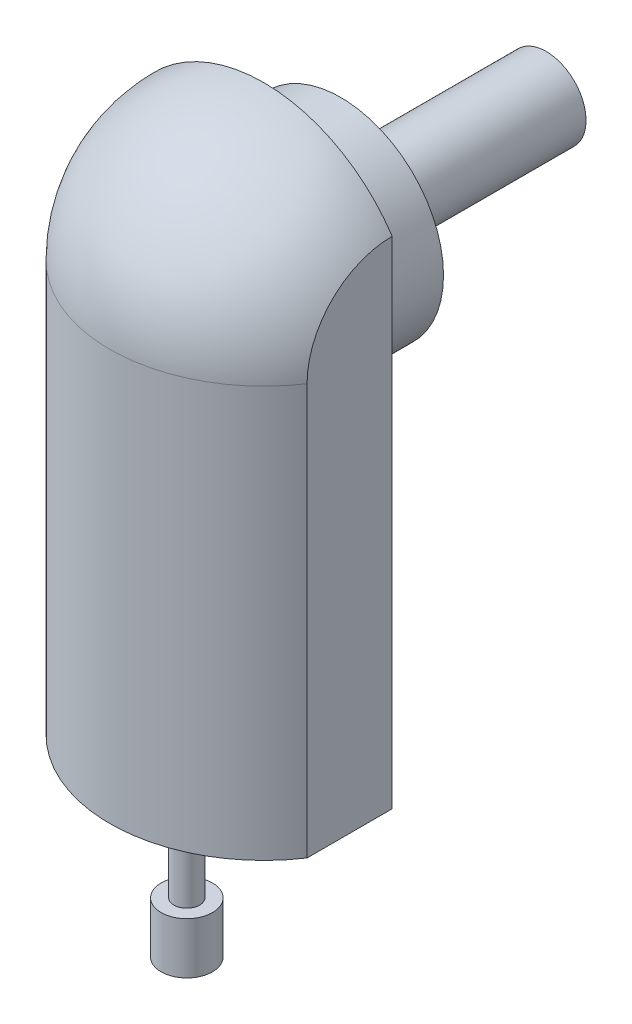
ISO-10303-21;
HEADER;
FILE_DESCRIPTION(('STEP AP214'),'2;1');
FILE_NAME('part.step','',(''),(''),'','','');
FILE_SCHEMA(('AUTOMOTIVE_DESIGN { 1 0 10303 214 1 1 1 1 }'));
ENDSEC;
DATA;
#1=APPLICATION_CONTEXT('core data for automotive mechanical design processes');
#2=APPLICATION_PROTOCOL_DEFINITION('international standard','automotive_design',2000,#1);
#3=PRODUCT_CONTEXT('',#1,'mechanical');
#4=PRODUCT('Part','Part','',(#3));
#5=PRODUCT_RELATED_PRODUCT_CATEGORY('part','',(#4));
#6=PRODUCT_DEFINITION_FORMATION('','',#4);
#7=PRODUCT_DEFINITION_CONTEXT('part definition',#1,'design');
#8=PRODUCT_DEFINITION('design','',#6,#7);
#9=PRODUCT_DEFINITION_SHAPE('','',#8);
#10=(LENGTH_UNIT() NAMED_UNIT(*) SI_UNIT(.MILLI.,.METRE.));
#11=(NAMED_UNIT(*) PLANE_ANGLE_UNIT() SI_UNIT($,.RADIAN.));
#12=(NAMED_UNIT(*) SI_UNIT($,.STERADIAN.) SOLID_ANGLE_UNIT());
#13=UNCERTAINTY_MEASURE_WITH_UNIT(LENGTH_MEASURE(1.E-05),#10,'distance_accuracy_value','');
#14=(GEOMETRIC_REPRESENTATION_CONTEXT(3) GLOBAL_UNCERTAINTY_ASSIGNED_CONTEXT((#13)) GLOBAL_UNIT_ASSIGNED_CONTEXT((#10,
#11,#12)) REPRESENTATION_CONTEXT('',''));
#15=CARTESIAN_POINT('',(0.,0.,0.));
#16=DIRECTION('',(0.,0.,1.));
#17=DIRECTION('',(1.,0.,0.));
#18=AXIS2_PLACEMENT_3D('',#15,#16,#17);
#19=CARTESIAN_POINT('',(0.,0.,38.1));
#20=DIRECTION('',(0.,1.,0.));
#21=DIRECTION('',(-1.,0.,0.));
#22=AXIS2_PLACEMENT_3D('',#19,#20,#21);
#23=SPHERICAL_SURFACE('',#22,76.2);
#24=CARTESIAN_POINT('',(-63.5,0.,38.1));
#25=DIRECTION('',(-1.,0.,0.));
#26=DIRECTION('',(0.,0.,1.));
#27=AXIS2_PLACEMENT_3D('',#24,#25,#26);
#28=CIRCLE('',#27,42.1211348375135);
#29=CARTESIAN_POINT('',(-63.5,0.,80.2211348375136));
#30=VERTEX_POINT('',#29);
#31=CARTESIAN_POINT('',(-63.5,42.1211348375135,38.1));
#32=VERTEX_POINT('',#31);
#33=EDGE_CURVE('E320',#30,#32,#28,.T.);
#34=ORIENTED_EDGE('',*,*,#33,.F.);
#35=CARTESIAN_POINT('',(0.,0.,38.1));
#36=DIRECTION('',(0.,1.,0.));
#37=DIRECTION('',(0.,0.,-1.));
#38=AXIS2_PLACEMENT_3D('',#35,#36,#37);
#39=CIRCLE('',#38,76.2);
#40=CARTESIAN_POINT('',(63.5,0.,80.2211348375136));
#41=VERTEX_POINT('',#40);
#42=EDGE_CURVE('E335',#30,#41,#39,.T.);
#43=ORIENTED_EDGE('',*,*,#42,.T.);
#44=CARTESIAN_POINT('',(63.5,0.,38.1));
#45=DIRECTION('',(1.,0.,0.));
#46=DIRECTION('',(0.,0.,-1.));
#47=AXIS2_PLACEMENT_3D('',#44,#45,#46);
#48=CIRCLE('',#47,42.1211348375136);
#49=CARTESIAN_POINT('',(63.5,42.1211348375136,38.1));
#50=VERTEX_POINT('',#49);
#51=EDGE_CURVE('E331',#50,#41,#48,.T.);
#52=ORIENTED_EDGE('',*,*,#51,.F.);
#53=CARTESIAN_POINT('',(0.,0.,38.1));
#54=DIRECTION('',(0.,0.,-1.));
#55=DIRECTION('',(-1.,0.,0.));
#56=AXIS2_PLACEMENT_3D('',#53,#54,#55);
#57=CIRCLE('',#56,76.2);
#58=EDGE_CURVE('E343',#32,#50,#57,.T.);
#59=ORIENTED_EDGE('',*,*,#58,.F.);
#60=EDGE_LOOP('',(#34,#43,#52,#59));
#61=FACE_BOUND('',#60,.T.);
#62=ADVANCED_FACE('F41',(#61),#23,.T.);
#63=CARTESIAN_POINT('',(0.,0.,38.1));
#64=DIRECTION('',(0.,0.,-1.));
#65=DIRECTION('',(-1.,0.,0.));
#66=AXIS2_PLACEMENT_3D('',#63,#64,#65);
#67=PLANE('',#66);
#68=CARTESIAN_POINT('',(0.,0.,38.1));
#69=DIRECTION('',(0.,0.,1.));
#70=DIRECTION('',(1.,0.,0.));
#71=AXIS2_PLACEMENT_3D('',#68,#69,#70);
#72=CIRCLE('',#71,50.8);
#73=CARTESIAN_POINT('',(-50.8,0.,38.1));
#74=VERTEX_POINT('',#73);
#75=EDGE_CURVE('E349',#74,#74,#72,.T.);
#76=ORIENTED_EDGE('',*,*,#75,.T.);
#77=EDGE_LOOP('',(#76));
#78=FACE_BOUND('',#77,.T.);
#79=DIRECTION('',(-1.,0.,0.));
#80=VECTOR('',#79,1.);
#81=CARTESIAN_POINT('',(-76.2,-203.2,38.0999999999994));
#82=LINE('',#81,#80);
#83=CARTESIAN_POINT('',(63.5,-203.2,38.1));
#84=VERTEX_POINT('',#83);
#85=CARTESIAN_POINT('',(-63.5,-203.2,38.0999999999995));
#86=VERTEX_POINT('',#85);
#87=EDGE_CURVE('E339',#84,#86,#82,.T.);
#88=ORIENTED_EDGE('',*,*,#87,.T.);
#89=DIRECTION('',(0.,1.,0.));
#90=VECTOR('',#89,1.);
#91=CARTESIAN_POINT('',(-63.5,-203.2,38.1));
#92=LINE('',#91,#90);
#93=EDGE_CURVE('E311',#86,#32,#92,.T.);
#94=ORIENTED_EDGE('',*,*,#93,.T.);
#95=ORIENTED_EDGE('',*,*,#58,.T.);
#96=DIRECTION('',(0.,1.,0.));
#97=VECTOR('',#96,1.);
#98=CARTESIAN_POINT('',(63.5,-203.2,38.1));
#99=LINE('',#98,#97);
#100=EDGE_CURVE('E323',#84,#50,#99,.T.);
#101=ORIENTED_EDGE('',*,*,#100,.F.);
#102=EDGE_LOOP('',(#88,#94,#95,#101));
#103=FACE_BOUND('',#102,.T.);
#104=ADVANCED_FACE('F367',(#78,#103),#67,.T.);
#105=CARTESIAN_POINT('',(0.,-203.2,38.1));
#106=DIRECTION('',(0.,1.,0.));
#107=DIRECTION('',(0.,0.,1.));
#108=AXIS2_PLACEMENT_3D('',#105,#106,#107);
#109=CYLINDRICAL_SURFACE('',#108,76.2);
#110=ORIENTED_EDGE('',*,*,#42,.F.);
#111=DIRECTION('',(0.,1.,0.));
#112=VECTOR('',#111,1.);
#113=CARTESIAN_POINT('',(-63.5,-203.2,80.2211348375136));
#114=LINE('',#113,#112);
#115=CARTESIAN_POINT('',(-63.5,-203.2,80.2211348375136));
#116=VERTEX_POINT('',#115);
#117=EDGE_CURVE('E316',#30,#116,#114,.F.);
#118=ORIENTED_EDGE('',*,*,#117,.T.);
#119=CARTESIAN_POINT('',(0.,-203.2,38.1));
#120=DIRECTION('',(0.,1.,0.));
#121=DIRECTION('',(0.,0.,-1.));
#122=AXIS2_PLACEMENT_3D('',#119,#120,#121);
#123=CIRCLE('',#122,76.2);
#124=CARTESIAN_POINT('',(63.5,-203.2,80.2211348375136));
#125=VERTEX_POINT('',#124);
#126=EDGE_CURVE('E336',#116,#125,#123,.T.);
#127=ORIENTED_EDGE('',*,*,#126,.T.);
#128=DIRECTION('',(0.,1.,0.));
#129=VECTOR('',#128,1.);
#130=CARTESIAN_POINT('',(63.5,-203.2,80.2211348375136));
#131=LINE('',#130,#129);
#132=EDGE_CURVE('E327',#125,#41,#131,.T.);
#133=ORIENTED_EDGE('',*,*,#132,.T.);
#134=EDGE_LOOP('',(#110,#118,#127,#133));
#135=FACE_BOUND('',#134,.T.);
#136=ADVANCED_FACE('F377',(#135),#109,.T.);
#137=CARTESIAN_POINT('',(0.,-203.2,38.1));
#138=DIRECTION('',(0.,-1.,0.));
#139=DIRECTION('',(0.,0.,-1.));
#140=AXIS2_PLACEMENT_3D('',#137,#138,#139);
#141=PLANE('',#140);
#142=CARTESIAN_POINT('',(0.,-203.2,76.2));
#143=DIRECTION('',(0.,-1.,0.));
#144=DIRECTION('',(0.,0.,-1.));
#145=AXIS2_PLACEMENT_3D('',#142,#143,#144);
#146=CIRCLE('',#145,6.35);
#147=CARTESIAN_POINT('',(0.,-203.2,69.85));
#148=VERTEX_POINT('',#147);
#149=EDGE_CURVE('E297',#148,#148,#146,.T.);
#150=ORIENTED_EDGE('',*,*,#149,.F.);
#151=EDGE_LOOP('',(#150));
#152=FACE_BOUND('',#151,.T.);
#153=ORIENTED_EDGE('',*,*,#126,.F.);
#154=DIRECTION('',(0.,0.,-1.));
#155=VECTOR('',#154,1.);
#156=CARTESIAN_POINT('',(-63.5,-203.2,38.1));
#157=LINE('',#156,#155);
#158=EDGE_CURVE('E45',#116,#86,#157,.T.);
#159=ORIENTED_EDGE('',*,*,#158,.T.);
#160=ORIENTED_EDGE('',*,*,#87,.F.);
#161=DIRECTION('',(0.,0.,1.));
#162=VECTOR('',#161,1.);
#163=CARTESIAN_POINT('',(63.5,-203.2,38.1));
#164=LINE('',#163,#162);
#165=EDGE_CURVE('E353',#84,#125,#164,.T.);
#166=ORIENTED_EDGE('',*,*,#165,.T.);
#167=EDGE_LOOP('',(#153,#159,#160,#166));
#168=FACE_BOUND('',#167,.T.);
#169=ADVANCED_FACE('F363',(#152,#168),#141,.T.);
#170=CARTESIAN_POINT('',(0.,0.,38.1));
#171=DIRECTION('',(0.,0.,-1.));
#172=DIRECTION('',(-1.,0.,0.));
#173=AXIS2_PLACEMENT_3D('',#170,#171,#172);
#174=CYLINDRICAL_SURFACE('',#173,50.8);
#175=CARTESIAN_POINT('',(0.,0.,0.));
#176=DIRECTION('',(0.,0.,1.));
#177=DIRECTION('',(1.,0.,0.));
#178=AXIS2_PLACEMENT_3D('',#175,#176,#177);
#179=CIRCLE('',#178,50.8);
#180=CARTESIAN_POINT('',(-50.8,0.,0.));
#181=VERTEX_POINT('',#180);
#182=EDGE_CURVE('E348',#181,#181,#179,.T.);
#183=CARTESIAN_POINT('',(-50.8,0.,38.1));
#184=CARTESIAN_POINT('',(-50.8,0.,37.703125));
#185=CARTESIAN_POINT('',(-50.8,0.,37.30625));
#186=CARTESIAN_POINT('',(-50.8,0.,36.5125));
#187=CARTESIAN_POINT('',(-50.8,0.,36.115625));
#188=CARTESIAN_POINT('',(-50.8,0.,35.321875));
#189=CARTESIAN_POINT('',(-50.8,0.,34.925));
#190=CARTESIAN_POINT('',(-50.8,0.,34.13125));
#191=CARTESIAN_POINT('',(-50.8,0.,33.734375));
#192=CARTESIAN_POINT('',(-50.8,0.,32.940625));
#193=CARTESIAN_POINT('',(-50.8,0.,32.54375));
#194=CARTESIAN_POINT('',(-50.8,0.,31.75));
#195=CARTESIAN_POINT('',(-50.8,0.,31.353125));
#196=CARTESIAN_POINT('',(-50.8,0.,30.559375));
#197=CARTESIAN_POINT('',(-50.8,0.,30.1625));
#198=CARTESIAN_POINT('',(-50.8,0.,29.36875));
#199=CARTESIAN_POINT('',(-50.8,0.,28.971875));
#200=CARTESIAN_POINT('',(-50.8,0.,28.178125));
#201=CARTESIAN_POINT('',(-50.8,0.,27.78125));
#202=CARTESIAN_POINT('',(-50.8,0.,26.9875));
#203=CARTESIAN_POINT('',(-50.8,0.,26.590625));
#204=CARTESIAN_POINT('',(-50.8,0.,25.796875));
#205=CARTESIAN_POINT('',(-50.8,0.,25.4));
#206=CARTESIAN_POINT('',(-50.8,0.,24.60625));
#207=CARTESIAN_POINT('',(-50.8,0.,24.209375));
#208=CARTESIAN_POINT('',(-50.8,0.,23.415625));
#209=CARTESIAN_POINT('',(-50.8,0.,23.01875));
#210=CARTESIAN_POINT('',(-50.8,0.,22.225));
#211=CARTESIAN_POINT('',(-50.8,0.,21.828125));
#212=CARTESIAN_POINT('',(-50.8,0.,21.034375));
#213=CARTESIAN_POINT('',(-50.8,0.,20.6375));
#214=CARTESIAN_POINT('',(-50.8,0.,19.84375));
#215=CARTESIAN_POINT('',(-50.8,0.,19.446875));
#216=CARTESIAN_POINT('',(-50.8,0.,18.653125));
#217=CARTESIAN_POINT('',(-50.8,0.,18.25625));
#218=CARTESIAN_POINT('',(-50.8,0.,17.4625));
#219=CARTESIAN_POINT('',(-50.8,0.,17.065625));
#220=CARTESIAN_POINT('',(-50.8,0.,16.271875));
#221=CARTESIAN_POINT('',(-50.8,0.,15.875));
#222=CARTESIAN_POINT('',(-50.8,0.,15.08125));
#223=CARTESIAN_POINT('',(-50.8,0.,14.684375));
#224=CARTESIAN_POINT('',(-50.8,0.,13.890625));
#225=CARTESIAN_POINT('',(-50.8,0.,13.49375));
#226=CARTESIAN_POINT('',(-50.8,0.,12.7));
#227=CARTESIAN_POINT('',(-50.8,0.,12.303125));
#228=CARTESIAN_POINT('',(-50.8,0.,11.509375));
#229=CARTESIAN_POINT('',(-50.8,0.,11.1125));
#230=CARTESIAN_POINT('',(-50.8,0.,10.31875));
#231=CARTESIAN_POINT('',(-50.8,0.,9.92187499999999));
#232=CARTESIAN_POINT('',(-50.8,0.,9.128125));
#233=CARTESIAN_POINT('',(-50.8,0.,8.73124999999999));
#234=CARTESIAN_POINT('',(-50.8,0.,7.93749999999999));
#235=CARTESIAN_POINT('',(-50.8,0.,7.54062499999999));
#236=CARTESIAN_POINT('',(-50.8,0.,6.746875));
#237=CARTESIAN_POINT('',(-50.8,0.,6.35));
#238=CARTESIAN_POINT('',(-50.8,0.,5.55625));
#239=CARTESIAN_POINT('',(-50.8,0.,5.159375));
#240=CARTESIAN_POINT('',(-50.8,0.,4.365625));
#241=CARTESIAN_POINT('',(-50.8,0.,3.96875));
#242=CARTESIAN_POINT('',(-50.8,0.,3.175));
#243=CARTESIAN_POINT('',(-50.8,0.,2.778125));
#244=CARTESIAN_POINT('',(-50.8,0.,1.984375));
#245=CARTESIAN_POINT('',(-50.8,0.,1.5875));
#246=CARTESIAN_POINT('',(-50.8,0.,0.79375));
#247=CARTESIAN_POINT('',(-50.8,0.,0.396875));
#248=CARTESIAN_POINT('',(-50.8,0.,0.));
#249=B_SPLINE_CURVE_WITH_KNOTS('',3,(#183,#184,#185,#186,#187,#188,#189,#190,#191,#192,#193,
#194,#195,#196,#197,#198,#199,#200,#201,#202,#203,#204,#205,#206,#207,#208,#209,#210,#211,#212,
#213,#214,#215,#216,#217,#218,#219,#220,#221,#222,#223,#224,#225,#226,#227,#228,#229,#230,#231,
#232,#233,#234,#235,#236,#237,#238,#239,#240,#241,#242,#243,#244,#245,#246,#247,#248),
.UNSPECIFIED.,.F.,.F.,(4,2,2,2,2,2,2,2,2,2,2,2,2,2,2,2,2,2,2,2,2,2,2,2,2,2,2,2,2,2,2,2,4),(0.,
1.190625,2.38125,3.571875,4.7625,5.953125,7.14375,8.334375,9.52500000000001,10.715625,11.90625,
13.096875,14.2875,15.478125,16.66875,17.859375,19.05,20.240625,21.43125,22.621875,23.8125,
25.003125,26.19375,27.384375,28.575,29.765625,30.95625,32.146875,33.3375,34.528125,35.71875,
36.909375,38.1),.UNSPECIFIED.);
#250=EDGE_CURVE('BSEAM43',#74,#181,#249,.T.);
#251=ORIENTED_EDGE('',*,*,#75,.F.);
#252=ORIENTED_EDGE('',*,*,#182,.T.);
#253=ORIENTED_EDGE('',*,*,#250,.T.);
#254=ORIENTED_EDGE('',*,*,#250,.F.);
#255=EDGE_LOOP('',(#251,#253,#252,#254));
#256=FACE_BOUND('',#255,.T.);
#257=ADVANCED_FACE('F43',(#256),#174,.T.);
#258=CARTESIAN_POINT('',(0.,0.,0.));
#259=DIRECTION('',(0.,0.,1.));
#260=DIRECTION('',(1.,0.,0.));
#261=AXIS2_PLACEMENT_3D('',#258,#259,#260);
#262=PLANE('',#261);
#263=CARTESIAN_POINT('',(0.,0.,0.));
#264=DIRECTION('',(0.,0.,-1.));
#265=DIRECTION('',(-1.,0.,0.));
#266=AXIS2_PLACEMENT_3D('',#263,#264,#265);
#267=CIRCLE('',#266,19.7047921076596);
#268=CARTESIAN_POINT('',(-19.7047921076596,0.,0.));
#269=VERTEX_POINT('',#268);
#270=EDGE_CURVE('E11',#269,#269,#267,.T.);
#271=ORIENTED_EDGE('',*,*,#270,.F.);
#272=EDGE_LOOP('',(#271));
#273=FACE_BOUND('',#272,.T.);
#274=ORIENTED_EDGE('',*,*,#182,.F.);
#275=EDGE_LOOP('',(#274));
#276=FACE_BOUND('',#275,.T.);
#277=ADVANCED_FACE('F389',(#273,#276),#262,.F.);
#278=CARTESIAN_POINT('',(63.5,0.,0.));
#279=DIRECTION('',(1.,0.,0.));
#280=DIRECTION('',(0.,0.,-1.));
#281=AXIS2_PLACEMENT_3D('',#278,#279,#280);
#282=PLANE('',#281);
#283=ORIENTED_EDGE('',*,*,#51,.T.);
#284=ORIENTED_EDGE('',*,*,#132,.F.);
#285=ORIENTED_EDGE('',*,*,#165,.F.);
#286=ORIENTED_EDGE('',*,*,#100,.T.);
#287=EDGE_LOOP('',(#283,#284,#285,#286));
#288=FACE_BOUND('',#287,.T.);
#289=ADVANCED_FACE('F371',(#288),#282,.T.);
#290=CARTESIAN_POINT('',(-63.5,0.,0.));
#291=DIRECTION('',(-1.,0.,0.));
#292=DIRECTION('',(0.,0.,-1.));
#293=AXIS2_PLACEMENT_3D('',#290,#291,#292);
#294=PLANE('',#293);
#295=ORIENTED_EDGE('',*,*,#33,.T.);
#296=ORIENTED_EDGE('',*,*,#93,.F.);
#297=ORIENTED_EDGE('',*,*,#158,.F.);
#298=ORIENTED_EDGE('',*,*,#117,.F.);
#299=EDGE_LOOP('',(#295,#296,#297,#298));
#300=FACE_BOUND('',#299,.T.);
#301=ADVANCED_FACE('F378',(#300),#294,.T.);
#302=CARTESIAN_POINT('',(0.,0.,-101.6));
#303=DIRECTION('',(0.,0.,1.));
#304=DIRECTION('',(1.,0.,0.));
#305=AXIS2_PLACEMENT_3D('',#302,#303,#304);
#306=CYLINDRICAL_SURFACE('',#305,19.7047921076596);
#307=CARTESIAN_POINT('',(0.,0.,-101.6));
#308=DIRECTION('',(0.,0.,-1.));
#309=DIRECTION('',(-1.,0.,0.));
#310=AXIS2_PLACEMENT_3D('',#307,#308,#309);
#311=CIRCLE('',#310,19.7047921076596);
#312=CARTESIAN_POINT('',(-19.7047921076596,0.,-101.6));
#313=VERTEX_POINT('',#312);
#314=EDGE_CURVE('E305',#313,#313,#311,.T.);
#315=ORIENTED_EDGE('',*,*,#314,.F.);
#316=EDGE_LOOP('',(#315));
#317=FACE_BOUND('',#316,.T.);
#318=ORIENTED_EDGE('',*,*,#270,.T.);
#319=EDGE_LOOP('',(#318));
#320=FACE_BOUND('',#319,.T.);
#321=ADVANCED_FACE('F380',(#317,#320),#306,.T.);
#322=CARTESIAN_POINT('',(0.,0.,-101.6));
#323=DIRECTION('',(0.,0.,-1.));
#324=DIRECTION('',(-1.,0.,0.));
#325=AXIS2_PLACEMENT_3D('',#322,#323,#324);
#326=PLANE('',#325);
#327=ORIENTED_EDGE('',*,*,#314,.T.);
#328=EDGE_LOOP('',(#327));
#329=FACE_BOUND('',#328,.T.);
#330=ADVANCED_FACE('F386',(#329),#326,.T.);
#331=CARTESIAN_POINT('',(0.,-254.,76.2));
#332=DIRECTION('',(0.,1.,0.));
#333=DIRECTION('',(0.,0.,1.));
#334=AXIS2_PLACEMENT_3D('',#331,#332,#333);
#335=CYLINDRICAL_SURFACE('',#334,6.35);
#336=CARTESIAN_POINT('',(0.,-254.,76.2));
#337=DIRECTION('',(0.,-1.,0.));
#338=DIRECTION('',(0.,0.,-1.));
#339=AXIS2_PLACEMENT_3D('',#336,#337,#338);
#340=CIRCLE('',#339,6.35);
#341=CARTESIAN_POINT('',(0.,-254.,69.85));
#342=VERTEX_POINT('',#341);
#343=EDGE_CURVE('E301',#342,#342,#340,.T.);
#344=ORIENTED_EDGE('',*,*,#343,.F.);
#345=EDGE_LOOP('',(#344));
#346=FACE_BOUND('',#345,.T.);
#347=ORIENTED_EDGE('',*,*,#149,.T.);
#348=EDGE_LOOP('',(#347));
#349=FACE_BOUND('',#348,.T.);
#350=ADVANCED_FACE('F421',(#346,#349),#335,.T.);
#351=CARTESIAN_POINT('',(0.,-279.4,76.2));
#352=DIRECTION('',(0.,1.,0.));
#353=DIRECTION('',(0.,0.,1.));
#354=AXIS2_PLACEMENT_3D('',#351,#352,#353);
#355=CYLINDRICAL_SURFACE('',#354,12.7);
#356=CARTESIAN_POINT('',(0.,-279.4,76.2));
#357=DIRECTION('',(0.,-1.,0.));
#358=DIRECTION('',(0.,0.,-1.));
#359=AXIS2_PLACEMENT_3D('',#356,#357,#358);
#360=CIRCLE('',#359,12.7);
#361=CARTESIAN_POINT('',(0.,-279.4,63.5));
#362=VERTEX_POINT('',#361);
#363=EDGE_CURVE('E293',#362,#362,#360,.T.);
#364=ORIENTED_EDGE('',*,*,#363,.F.);
#365=EDGE_LOOP('',(#364));
#366=FACE_BOUND('',#365,.T.);
#367=CARTESIAN_POINT('',(0.,-254.,76.2));
#368=DIRECTION('',(0.,-1.,0.));
#369=DIRECTION('',(0.,0.,-1.));
#370=AXIS2_PLACEMENT_3D('',#367,#368,#369);
#371=CIRCLE('',#370,12.7);
#372=CARTESIAN_POINT('',(0.,-254.,63.5));
#373=VERTEX_POINT('',#372);
#374=EDGE_CURVE('E283',#373,#373,#371,.T.);
#375=ORIENTED_EDGE('',*,*,#374,.T.);
#376=EDGE_LOOP('',(#375));
#377=FACE_BOUND('',#376,.T.);
#378=ADVANCED_FACE('F423',(#366,#377),#355,.T.);
#379=CARTESIAN_POINT('',(0.,-279.4,76.2));
#380=DIRECTION('',(0.,-1.,0.));
#381=DIRECTION('',(0.,0.,-1.));
#382=AXIS2_PLACEMENT_3D('',#379,#380,#381);
#383=PLANE('',#382);
#384=CARTESIAN_POINT('',(0.,-279.4,76.2));
#385=DIRECTION('',(0.,1.,0.));
#386=DIRECTION('',(0.,0.,-1.));
#387=AXIS2_PLACEMENT_3D('',#384,#385,#386);
#388=CIRCLE('',#387,7.43174427837488);
#389=CARTESIAN_POINT('',(0.,-279.4,68.7682557216251));
#390=VERTEX_POINT('',#389);
#391=CARTESIAN_POINT('',(-6.77807617925276,-279.4,73.1522949080654));
#392=VERTEX_POINT('',#391);
#393=EDGE_CURVE('E58',#390,#392,#388,.T.);
#394=ORIENTED_EDGE('',*,*,#393,.F.);
#395=DIRECTION('',(0.,0.,1.));
#396=VECTOR('',#395,1.);
#397=CARTESIAN_POINT('',(0.,-279.4,68.7682557216251));
#398=LINE('',#397,#396);
#399=CARTESIAN_POINT('',(0.,-279.4,66.5464125625799));
#400=VERTEX_POINT('',#399);
#401=EDGE_CURVE('E213',#400,#390,#398,.T.);
#402=ORIENTED_EDGE('',*,*,#401,.F.);
#403=CARTESIAN_POINT('',(0.,-279.4,76.2));
#404=DIRECTION('',(0.,-1.,0.));
#405=DIRECTION('',(0.,0.,-1.));
#406=AXIS2_PLACEMENT_3D('',#403,#404,#405);
#407=CIRCLE('',#406,9.65358743742012);
#408=CARTESIAN_POINT('',(-8.80449442324183,-279.4,72.2411329445131));
#409=VERTEX_POINT('',#408);
#410=EDGE_CURVE('E232',#409,#400,#407,.T.);
#411=ORIENTED_EDGE('',*,*,#410,.F.);
#412=DIRECTION('',(-0.912043784791656,0.,-0.410092836590585));
#413=VECTOR('',#412,1.);
#414=CARTESIAN_POINT('',(-6.77807617925276,-279.4,73.1522949080654));
#415=LINE('',#414,#413);
#416=EDGE_CURVE('E228',#392,#409,#415,.T.);
#417=ORIENTED_EDGE('',*,*,#416,.F.);
#418=EDGE_LOOP('',(#394,#402,#411,#417));
#419=FACE_BOUND('',#418,.T.);
#420=CARTESIAN_POINT('',(0.,-279.4,76.2));
#421=DIRECTION('',(0.,1.,0.));
#422=DIRECTION('',(0.,0.,-1.));
#423=AXIS2_PLACEMENT_3D('',#420,#421,#422);
#424=CIRCLE('',#423,7.43174427837489);
#425=CARTESIAN_POINT('',(6.06793670222131,-279.4,80.4908002979623));
#426=VERTEX_POINT('',#425);
#427=CARTESIAN_POINT('',(6.77807617925276,-279.4,73.1522949080654));
#428=VERTEX_POINT('',#427);
#429=EDGE_CURVE('E66',#426,#428,#424,.T.);
#430=ORIENTED_EDGE('',*,*,#429,.F.);
#431=DIRECTION('',(-0.816488898827961,0.,-0.577361133165979));
#432=VECTOR('',#431,1.);
#433=CARTESIAN_POINT('',(6.06793670222131,-279.4,80.4908002979623));
#434=LINE('',#433,#432);
#435=CARTESIAN_POINT('',(7.8820469765186,-279.4,81.7736061819857));
#436=VERTEX_POINT('',#435);
#437=EDGE_CURVE('E179',#436,#426,#434,.T.);
#438=ORIENTED_EDGE('',*,*,#437,.F.);
#439=CARTESIAN_POINT('',(0.,-279.4,76.2));
#440=DIRECTION('',(0.,-1.,0.));
#441=DIRECTION('',(0.,0.,-1.));
#442=AXIS2_PLACEMENT_3D('',#439,#440,#441);
#443=CIRCLE('',#442,9.65358743742012);
#444=CARTESIAN_POINT('',(8.80449442324183,-279.4,72.2411329445131));
#445=VERTEX_POINT('',#444);
#446=EDGE_CURVE('E183',#445,#436,#443,.T.);
#447=ORIENTED_EDGE('',*,*,#446,.F.);
#448=DIRECTION('',(0.912043784791656,0.,-0.410092836590584));
#449=VECTOR('',#448,1.);
#450=CARTESIAN_POINT('',(6.77807617925276,-279.4,73.1522949080654));
#451=LINE('',#450,#449);
#452=EDGE_CURVE('E192',#428,#445,#451,.T.);
#453=ORIENTED_EDGE('',*,*,#452,.F.);
#454=EDGE_LOOP('',(#430,#438,#447,#453));
#455=FACE_BOUND('',#454,.T.);
#456=CARTESIAN_POINT('',(0.,-279.4,76.2));
#457=DIRECTION('',(0.,1.,0.));
#458=DIRECTION('',(0.,0.,-1.));
#459=AXIS2_PLACEMENT_3D('',#456,#457,#458);
#460=CIRCLE('',#459,7.43174427837488);
#461=CARTESIAN_POINT('',(-6.06793670222131,-279.4,80.4908002979623));
#462=VERTEX_POINT('',#461);
#463=CARTESIAN_POINT('',(0.,-279.4,83.6317442783749));
#464=VERTEX_POINT('',#463);
#465=EDGE_CURVE('E202',#462,#464,#460,.T.);
#466=ORIENTED_EDGE('',*,*,#465,.F.);
#467=DIRECTION('',(0.816488898827961,0.,-0.577361133165979));
#468=VECTOR('',#467,1.);
#469=CARTESIAN_POINT('',(-6.06793670222131,-279.4,80.4908002979623));
#470=LINE('',#469,#468);
#471=CARTESIAN_POINT('',(-7.88204697651859,-279.4,81.7736061819857));
#472=VERTEX_POINT('',#471);
#473=EDGE_CURVE('E254',#472,#462,#470,.T.);
#474=ORIENTED_EDGE('',*,*,#473,.F.);
#475=CARTESIAN_POINT('',(0.,-279.4,76.2));
#476=DIRECTION('',(0.,-1.,0.));
#477=DIRECTION('',(0.,0.,-1.));
#478=AXIS2_PLACEMENT_3D('',#475,#476,#477);
#479=CIRCLE('',#478,9.65358743742012);
#480=CARTESIAN_POINT('',(0.,-279.4,85.8535874374201));
#481=VERTEX_POINT('',#480);
#482=EDGE_CURVE('E273',#481,#472,#479,.T.);
#483=ORIENTED_EDGE('',*,*,#482,.F.);
#484=DIRECTION('',(0.,0.,1.));
#485=VECTOR('',#484,1.);
#486=CARTESIAN_POINT('',(0.,-279.4,83.6317442783749));
#487=LINE('',#486,#485);
#488=EDGE_CURVE('E269',#464,#481,#487,.T.);
#489=ORIENTED_EDGE('',*,*,#488,.F.);
#490=EDGE_LOOP('',(#466,#474,#483,#489));
#491=FACE_BOUND('',#490,.T.);
#492=ORIENTED_EDGE('',*,*,#363,.T.);
#493=EDGE_LOOP('',(#492));
#494=FACE_BOUND('',#493,.T.);
#495=ADVANCED_FACE('F430',(#419,#455,#491,#494),#383,.T.);
#496=CARTESIAN_POINT('',(0.,-254.,76.2));
#497=DIRECTION('',(0.,-1.,0.));
#498=DIRECTION('',(0.,0.,-1.));
#499=AXIS2_PLACEMENT_3D('',#496,#497,#498);
#500=PLANE('',#499);
#501=ORIENTED_EDGE('',*,*,#343,.T.);
#502=EDGE_LOOP('',(#501));
#503=FACE_BOUND('',#502,.T.);
#504=ORIENTED_EDGE('',*,*,#374,.F.);
#505=EDGE_LOOP('',(#504));
#506=FACE_BOUND('',#505,.T.);
#507=ADVANCED_FACE('F437',(#503,#506),#500,.F.);
#508=CARTESIAN_POINT('',(0.,-266.7,76.2));
#509=DIRECTION('',(0.,-1.,0.));
#510=DIRECTION('',(0.,0.,-1.));
#511=AXIS2_PLACEMENT_3D('',#508,#509,#510);
#512=CYLINDRICAL_SURFACE('',#511,7.43174427837488);
#513=ORIENTED_EDGE('',*,*,#465,.T.);
#514=DIRECTION('',(0.,-1.,0.));
#515=VECTOR('',#514,1.);
#516=CARTESIAN_POINT('',(0.,-266.7,83.6317442783749));
#517=LINE('',#516,#515);
#518=CARTESIAN_POINT('',(0.,-266.7,83.6317442783749));
#519=VERTEX_POINT('',#518);
#520=EDGE_CURVE('E266',#519,#464,#517,.T.);
#521=ORIENTED_EDGE('',*,*,#520,.F.);
#522=CARTESIAN_POINT('',(0.,-266.7,76.2));
#523=DIRECTION('',(0.,1.,0.));
#524=DIRECTION('',(0.,0.,-1.));
#525=AXIS2_PLACEMENT_3D('',#522,#523,#524);
#526=CIRCLE('',#525,7.43174427837488);
#527=CARTESIAN_POINT('',(-6.06793670222131,-266.7,80.4908002979623));
#528=VERTEX_POINT('',#527);
#529=EDGE_CURVE('E249',#528,#519,#526,.T.);
#530=ORIENTED_EDGE('',*,*,#529,.F.);
#531=DIRECTION('',(0.,-1.,0.));
#532=VECTOR('',#531,1.);
#533=CARTESIAN_POINT('',(-6.06793670222131,-266.7,80.4908002979623));
#534=LINE('',#533,#532);
#535=EDGE_CURVE('E280',#528,#462,#534,.T.);
#536=ORIENTED_EDGE('',*,*,#535,.T.);
#537=EDGE_LOOP('',(#513,#521,#530,#536));
#538=FACE_BOUND('',#537,.T.);
#539=ADVANCED_FACE('F440',(#538),#512,.T.);
#540=CARTESIAN_POINT('',(-6.06793670222131,-266.7,80.4908002979623));
#541=DIRECTION('',(-0.577361133165979,0.,-0.816488898827961));
#542=DIRECTION('',(-0.816488898827961,0.,0.577361133165979));
#543=AXIS2_PLACEMENT_3D('',#540,#541,#542);
#544=PLANE('',#543);
#545=ORIENTED_EDGE('',*,*,#473,.T.);
#546=ORIENTED_EDGE('',*,*,#535,.F.);
#547=DIRECTION('',(0.816488898827961,0.,-0.577361133165979));
#548=VECTOR('',#547,1.);
#549=CARTESIAN_POINT('',(-6.06793670222131,-266.7,80.4908002979623));
#550=LINE('',#549,#548);
#551=CARTESIAN_POINT('',(-7.88204697651859,-266.7,81.7736061819857));
#552=VERTEX_POINT('',#551);
#553=EDGE_CURVE('E262',#552,#528,#550,.T.);
#554=ORIENTED_EDGE('',*,*,#553,.F.);
#555=DIRECTION('',(0.,-1.,0.));
#556=VECTOR('',#555,1.);
#557=CARTESIAN_POINT('',(-7.88204697651859,-266.7,81.7736061819857));
#558=LINE('',#557,#556);
#559=EDGE_CURVE('E284',#552,#472,#558,.T.);
#560=ORIENTED_EDGE('',*,*,#559,.T.);
#561=EDGE_LOOP('',(#545,#546,#554,#560));
#562=FACE_BOUND('',#561,.T.);
#563=ADVANCED_FACE('F447',(#562),#544,.F.);
#564=CARTESIAN_POINT('',(0.,-266.7,76.2));
#565=DIRECTION('',(0.,-1.,0.));
#566=DIRECTION('',(0.,0.,-1.));
#567=AXIS2_PLACEMENT_3D('',#564,#565,#566);
#568=CYLINDRICAL_SURFACE('',#567,9.65358743742012);
#569=ORIENTED_EDGE('',*,*,#482,.T.);
#570=ORIENTED_EDGE('',*,*,#559,.F.);
#571=CARTESIAN_POINT('',(0.,-266.7,76.2));
#572=DIRECTION('',(0.,-1.,0.));
#573=DIRECTION('',(0.,0.,-1.));
#574=AXIS2_PLACEMENT_3D('',#571,#572,#573);
#575=CIRCLE('',#574,9.65358743742012);
#576=CARTESIAN_POINT('',(0.,-266.7,85.8535874374201));
#577=VERTEX_POINT('',#576);
#578=EDGE_CURVE('E258',#577,#552,#575,.T.);
#579=ORIENTED_EDGE('',*,*,#578,.F.);
#580=DIRECTION('',(0.,-1.,0.));
#581=VECTOR('',#580,1.);
#582=CARTESIAN_POINT('',(0.,-266.7,85.8535874374201));
#583=LINE('',#582,#581);
#584=EDGE_CURVE('E287',#577,#481,#583,.T.);
#585=ORIENTED_EDGE('',*,*,#584,.T.);
#586=EDGE_LOOP('',(#569,#570,#579,#585));
#587=FACE_BOUND('',#586,.T.);
#588=ADVANCED_FACE('F453',(#587),#568,.F.);
#589=CARTESIAN_POINT('',(0.,-266.7,83.6317442783749));
#590=DIRECTION('',(1.,0.,0.));
#591=DIRECTION('',(0.,0.,-1.));
#592=AXIS2_PLACEMENT_3D('',#589,#590,#591);
#593=PLANE('',#592);
#594=ORIENTED_EDGE('',*,*,#488,.T.);
#595=ORIENTED_EDGE('',*,*,#584,.F.);
#596=DIRECTION('',(0.,0.,1.));
#597=VECTOR('',#596,1.);
#598=CARTESIAN_POINT('',(0.,-266.7,83.6317442783749));
#599=LINE('',#598,#597);
#600=EDGE_CURVE('E253',#519,#577,#599,.T.);
#601=ORIENTED_EDGE('',*,*,#600,.F.);
#602=ORIENTED_EDGE('',*,*,#520,.T.);
#603=EDGE_LOOP('',(#594,#595,#601,#602));
#604=FACE_BOUND('',#603,.T.);
#605=ADVANCED_FACE('F449',(#604),#593,.F.);
#606=CARTESIAN_POINT('',(0.,-266.7,76.2));
#607=DIRECTION('',(0.,-1.,0.));
#608=DIRECTION('',(0.,0.,-1.));
#609=AXIS2_PLACEMENT_3D('',#606,#607,#608);
#610=PLANE('',#609);
#611=ORIENTED_EDGE('',*,*,#529,.T.);
#612=ORIENTED_EDGE('',*,*,#600,.T.);
#613=ORIENTED_EDGE('',*,*,#578,.T.);
#614=ORIENTED_EDGE('',*,*,#553,.T.);
#615=EDGE_LOOP('',(#611,#612,#613,#614));
#616=FACE_BOUND('',#615,.T.);
#617=ADVANCED_FACE('F452',(#616),#610,.T.);
#618=CARTESIAN_POINT('',(0.,-266.7,76.2));
#619=DIRECTION('',(0.,-1.,0.));
#620=DIRECTION('',(0.,0.,-1.));
#621=AXIS2_PLACEMENT_3D('',#618,#619,#620);
#622=CYLINDRICAL_SURFACE('',#621,7.43174427837489);
#623=ORIENTED_EDGE('',*,*,#429,.T.);
#624=DIRECTION('',(0.,-1.,0.));
#625=VECTOR('',#624,1.);
#626=CARTESIAN_POINT('',(6.77807617925276,-266.7,73.1522949080654));
#627=LINE('',#626,#625);
#628=CARTESIAN_POINT('',(6.77807617925276,-266.7,73.1522949080654));
#629=VERTEX_POINT('',#628);
#630=EDGE_CURVE('E154',#629,#428,#627,.T.);
#631=ORIENTED_EDGE('',*,*,#630,.F.);
#632=CARTESIAN_POINT('',(0.,-266.7,76.2));
#633=DIRECTION('',(0.,1.,0.));
#634=DIRECTION('',(0.,0.,-1.));
#635=AXIS2_PLACEMENT_3D('',#632,#633,#634);
#636=CIRCLE('',#635,7.43174427837489);
#637=CARTESIAN_POINT('',(6.06793670222131,-266.7,80.4908002979623));
#638=VERTEX_POINT('',#637);
#639=EDGE_CURVE('E158',#638,#629,#636,.T.);
#640=ORIENTED_EDGE('',*,*,#639,.F.);
#641=DIRECTION('',(0.,-1.,0.));
#642=VECTOR('',#641,1.);
#643=CARTESIAN_POINT('',(6.06793670222131,-266.7,80.4908002979623));
#644=LINE('',#643,#642);
#645=EDGE_CURVE('E199',#638,#426,#644,.T.);
#646=ORIENTED_EDGE('',*,*,#645,.T.);
#647=EDGE_LOOP('',(#623,#631,#640,#646));
#648=FACE_BOUND('',#647,.T.);
#649=ADVANCED_FACE('F156',(#648),#622,.T.);
#650=CARTESIAN_POINT('',(6.06793670222131,-266.7,80.4908002979623));
#651=DIRECTION('',(-0.577361133165979,0.,0.816488898827961));
#652=DIRECTION('',(0.816488898827961,0.,0.577361133165979));
#653=AXIS2_PLACEMENT_3D('',#650,#651,#652);
#654=PLANE('',#653);
#655=ORIENTED_EDGE('',*,*,#437,.T.);
#656=ORIENTED_EDGE('',*,*,#645,.F.);
#657=DIRECTION('',(-0.816488898827961,0.,-0.577361133165979));
#658=VECTOR('',#657,1.);
#659=CARTESIAN_POINT('',(6.06793670222131,-266.7,80.4908002979623));
#660=LINE('',#659,#658);
#661=CARTESIAN_POINT('',(7.8820469765186,-266.7,81.7736061819857));
#662=VERTEX_POINT('',#661);
#663=EDGE_CURVE('E165',#662,#638,#660,.T.);
#664=ORIENTED_EDGE('',*,*,#663,.F.);
#665=DIRECTION('',(0.,-1.,0.));
#666=VECTOR('',#665,1.);
#667=CARTESIAN_POINT('',(7.8820469765186,-266.7,81.7736061819857));
#668=LINE('',#667,#666);
#669=EDGE_CURVE('E203',#662,#436,#668,.T.);
#670=ORIENTED_EDGE('',*,*,#669,.T.);
#671=EDGE_LOOP('',(#655,#656,#664,#670));
#672=FACE_BOUND('',#671,.T.);
#673=ADVANCED_FACE('F485',(#672),#654,.F.);
#674=CARTESIAN_POINT('',(0.,-266.7,76.2));
#675=DIRECTION('',(0.,-1.,0.));
#676=DIRECTION('',(0.,0.,-1.));
#677=AXIS2_PLACEMENT_3D('',#674,#675,#676);
#678=CYLINDRICAL_SURFACE('',#677,9.65358743742012);
#679=ORIENTED_EDGE('',*,*,#446,.T.);
#680=ORIENTED_EDGE('',*,*,#669,.F.);
#681=CARTESIAN_POINT('',(0.,-266.7,76.2));
#682=DIRECTION('',(0.,-1.,0.));
#683=DIRECTION('',(0.,0.,-1.));
#684=AXIS2_PLACEMENT_3D('',#681,#682,#683);
#685=CIRCLE('',#684,9.65358743742012);
#686=CARTESIAN_POINT('',(8.80449442324183,-266.7,72.2411329445131));
#687=VERTEX_POINT('',#686);
#688=EDGE_CURVE('E174',#687,#662,#685,.T.);
#689=ORIENTED_EDGE('',*,*,#688,.F.);
#690=DIRECTION('',(0.,-1.,0.));
#691=VECTOR('',#690,1.);
#692=CARTESIAN_POINT('',(8.80449442324183,-266.7,72.2411329445131));
#693=LINE('',#692,#691);
#694=EDGE_CURVE('E164',#687,#445,#693,.T.);
#695=ORIENTED_EDGE('',*,*,#694,.T.);
#696=EDGE_LOOP('',(#679,#680,#689,#695));
#697=FACE_BOUND('',#696,.T.);
#698=ADVANCED_FACE('F488',(#697),#678,.F.);
#699=CARTESIAN_POINT('',(6.77807617925276,-266.7,73.1522949080654));
#700=DIRECTION('',(-0.410092836590584,0.,-0.912043784791656));
#701=DIRECTION('',(-0.912043784791656,0.,0.410092836590584));
#702=AXIS2_PLACEMENT_3D('',#699,#700,#701);
#703=PLANE('',#702);
#704=ORIENTED_EDGE('',*,*,#452,.T.);
#705=ORIENTED_EDGE('',*,*,#694,.F.);
#706=DIRECTION('',(0.912043784791656,0.,-0.410092836590584));
#707=VECTOR('',#706,1.);
#708=CARTESIAN_POINT('',(6.77807617925276,-266.7,73.1522949080654));
#709=LINE('',#708,#707);
#710=EDGE_CURVE('E168',#629,#687,#709,.T.);
#711=ORIENTED_EDGE('',*,*,#710,.F.);
#712=ORIENTED_EDGE('',*,*,#630,.T.);
#713=EDGE_LOOP('',(#704,#705,#711,#712));
#714=FACE_BOUND('',#713,.T.);
#715=ADVANCED_FACE('F169',(#714),#703,.F.);
#716=CARTESIAN_POINT('',(0.,-266.7,76.2));
#717=DIRECTION('',(0.,-1.,0.));
#718=DIRECTION('',(0.,0.,-1.));
#719=AXIS2_PLACEMENT_3D('',#716,#717,#718);
#720=PLANE('',#719);
#721=ORIENTED_EDGE('',*,*,#639,.T.);
#722=ORIENTED_EDGE('',*,*,#710,.T.);
#723=ORIENTED_EDGE('',*,*,#688,.T.);
#724=ORIENTED_EDGE('',*,*,#663,.T.);
#725=EDGE_LOOP('',(#721,#722,#723,#724));
#726=FACE_BOUND('',#725,.T.);
#727=ADVANCED_FACE('F176',(#726),#720,.T.);
#728=CARTESIAN_POINT('',(0.,-266.7,76.2));
#729=DIRECTION('',(0.,-1.,0.));
#730=DIRECTION('',(0.,0.,-1.));
#731=AXIS2_PLACEMENT_3D('',#728,#729,#730);
#732=CYLINDRICAL_SURFACE('',#731,7.43174427837488);
#733=ORIENTED_EDGE('',*,*,#393,.T.);
#734=DIRECTION('',(0.,-1.,0.));
#735=VECTOR('',#734,1.);
#736=CARTESIAN_POINT('',(-6.77807617925276,-266.7,73.1522949080654));
#737=LINE('',#736,#735);
#738=CARTESIAN_POINT('',(-6.77807617925276,-266.7,73.1522949080654));
#739=VERTEX_POINT('',#738);
#740=EDGE_CURVE('E225',#739,#392,#737,.T.);
#741=ORIENTED_EDGE('',*,*,#740,.F.);
#742=CARTESIAN_POINT('',(0.,-266.7,76.2));
#743=DIRECTION('',(0.,1.,0.));
#744=DIRECTION('',(0.,0.,-1.));
#745=AXIS2_PLACEMENT_3D('',#742,#743,#744);
#746=CIRCLE('',#745,7.43174427837488);
#747=CARTESIAN_POINT('',(0.,-266.7,68.7682557216251));
#748=VERTEX_POINT('',#747);
#749=EDGE_CURVE('E208',#748,#739,#746,.T.);
#750=ORIENTED_EDGE('',*,*,#749,.F.);
#751=DIRECTION('',(0.,-1.,0.));
#752=VECTOR('',#751,1.);
#753=CARTESIAN_POINT('',(0.,-266.7,68.7682557216251));
#754=LINE('',#753,#752);
#755=EDGE_CURVE('E193',#748,#390,#754,.T.);
#756=ORIENTED_EDGE('',*,*,#755,.T.);
#757=EDGE_LOOP('',(#733,#741,#750,#756));
#758=FACE_BOUND('',#757,.T.);
#759=ADVANCED_FACE('F464',(#758),#732,.T.);
#760=CARTESIAN_POINT('',(0.,-266.7,68.7682557216251));
#761=DIRECTION('',(1.,0.,0.));
#762=DIRECTION('',(0.,0.,-1.));
#763=AXIS2_PLACEMENT_3D('',#760,#761,#762);
#764=PLANE('',#763);
#765=ORIENTED_EDGE('',*,*,#401,.T.);
#766=ORIENTED_EDGE('',*,*,#755,.F.);
#767=DIRECTION('',(0.,0.,1.));
#768=VECTOR('',#767,1.);
#769=CARTESIAN_POINT('',(0.,-266.7,68.7682557216251));
#770=LINE('',#769,#768);
#771=CARTESIAN_POINT('',(0.,-266.7,66.5464125625799));
#772=VERTEX_POINT('',#771);
#773=EDGE_CURVE('E221',#772,#748,#770,.T.);
#774=ORIENTED_EDGE('',*,*,#773,.F.);
#775=DIRECTION('',(0.,-1.,0.));
#776=VECTOR('',#775,1.);
#777=CARTESIAN_POINT('',(0.,-266.7,66.5464125625799));
#778=LINE('',#777,#776);
#779=EDGE_CURVE('E241',#772,#400,#778,.T.);
#780=ORIENTED_EDGE('',*,*,#779,.T.);
#781=EDGE_LOOP('',(#765,#766,#774,#780));
#782=FACE_BOUND('',#781,.T.);
#783=ADVANCED_FACE('F467',(#782),#764,.F.);
#784=CARTESIAN_POINT('',(0.,-266.7,76.2));
#785=DIRECTION('',(0.,-1.,0.));
#786=DIRECTION('',(0.,0.,-1.));
#787=AXIS2_PLACEMENT_3D('',#784,#785,#786);
#788=CYLINDRICAL_SURFACE('',#787,9.65358743742012);
#789=ORIENTED_EDGE('',*,*,#410,.T.);
#790=ORIENTED_EDGE('',*,*,#779,.F.);
#791=CARTESIAN_POINT('',(0.,-266.7,76.2));
#792=DIRECTION('',(0.,-1.,0.));
#793=DIRECTION('',(0.,0.,-1.));
#794=AXIS2_PLACEMENT_3D('',#791,#792,#793);
#795=CIRCLE('',#794,9.65358743742012);
#796=CARTESIAN_POINT('',(-8.80449442324183,-266.7,72.2411329445131));
#797=VERTEX_POINT('',#796);
#798=EDGE_CURVE('E217',#797,#772,#795,.T.);
#799=ORIENTED_EDGE('',*,*,#798,.F.);
#800=DIRECTION('',(0.,-1.,0.));
#801=VECTOR('',#800,1.);
#802=CARTESIAN_POINT('',(-8.80449442324183,-266.7,72.2411329445131));
#803=LINE('',#802,#801);
#804=EDGE_CURVE('E244',#797,#409,#803,.T.);
#805=ORIENTED_EDGE('',*,*,#804,.T.);
#806=EDGE_LOOP('',(#789,#790,#799,#805));
#807=FACE_BOUND('',#806,.T.);
#808=ADVANCED_FACE('F472',(#807),#788,.F.);
#809=CARTESIAN_POINT('',(-6.77807617925276,-266.7,73.1522949080654));
#810=DIRECTION('',(-0.410092836590585,0.,0.912043784791656));
#811=DIRECTION('',(0.912043784791656,0.,0.410092836590585));
#812=AXIS2_PLACEMENT_3D('',#809,#810,#811);
#813=PLANE('',#812);
#814=ORIENTED_EDGE('',*,*,#416,.T.);
#815=ORIENTED_EDGE('',*,*,#804,.F.);
#816=DIRECTION('',(-0.912043784791656,0.,-0.410092836590585));
#817=VECTOR('',#816,1.);
#818=CARTESIAN_POINT('',(-6.77807617925276,-266.7,73.1522949080654));
#819=LINE('',#818,#817);
#820=EDGE_CURVE('E212',#739,#797,#819,.T.);
#821=ORIENTED_EDGE('',*,*,#820,.F.);
#822=ORIENTED_EDGE('',*,*,#740,.T.);
#823=EDGE_LOOP('',(#814,#815,#821,#822));
#824=FACE_BOUND('',#823,.T.);
#825=ADVANCED_FACE('F468',(#824),#813,.F.);
#826=CARTESIAN_POINT('',(0.,-266.7,76.2));
#827=DIRECTION('',(0.,-1.,0.));
#828=DIRECTION('',(0.,0.,-1.));
#829=AXIS2_PLACEMENT_3D('',#826,#827,#828);
#830=PLANE('',#829);
#831=ORIENTED_EDGE('',*,*,#749,.T.);
#832=ORIENTED_EDGE('',*,*,#820,.T.);
#833=ORIENTED_EDGE('',*,*,#798,.T.);
#834=ORIENTED_EDGE('',*,*,#773,.T.);
#835=EDGE_LOOP('',(#831,#832,#833,#834));
#836=FACE_BOUND('',#835,.T.);
#837=ADVANCED_FACE('F471',(#836),#830,.T.);
#838=CLOSED_SHELL('',(#62,#104,#136,#169,#257,#277,#289,#301,#321,#330,#350,#378,#495,#507,#539,
#563,#588,#605,#617,#649,#673,#698,#715,#727,#759,#783,#808,#825,#837));
#839=MANIFOLD_SOLID_BREP('B2',#838);
#840=ADVANCED_BREP_SHAPE_REPRESENTATION('',(#18,#839),#14);
#841=SHAPE_DEFINITION_REPRESENTATION(#9,#840);
ENDSEC;
END-ISO-10303-21;
